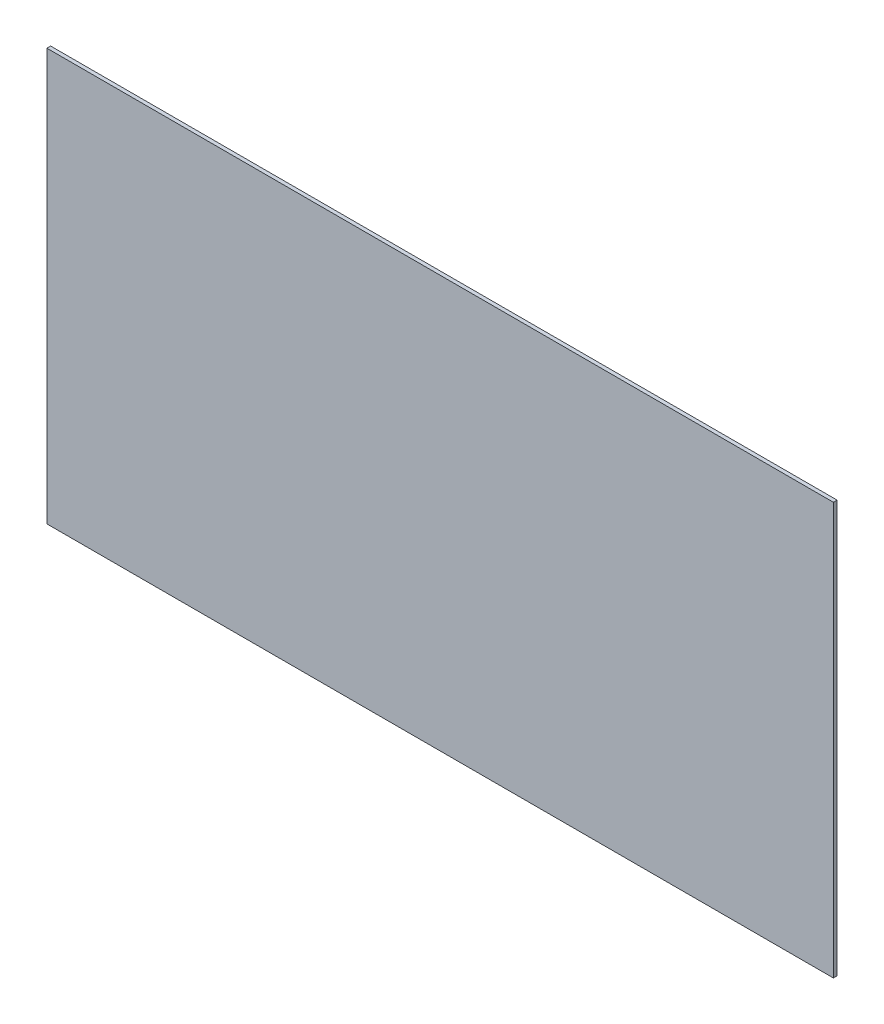
ISO-10303-21;
HEADER;
FILE_DESCRIPTION(('STEP AP214'),'2;1');
FILE_NAME('part.step','',(''),(''),'','','');
FILE_SCHEMA(('AUTOMOTIVE_DESIGN { 1 0 10303 214 1 1 1 1 }'));
ENDSEC;
DATA;
#1=APPLICATION_CONTEXT('core data for automotive mechanical design processes');
#2=APPLICATION_PROTOCOL_DEFINITION('international standard','automotive_design',2000,#1);
#3=PRODUCT_CONTEXT('',#1,'mechanical');
#4=PRODUCT('Part','Part','',(#3));
#5=PRODUCT_RELATED_PRODUCT_CATEGORY('part','',(#4));
#6=PRODUCT_DEFINITION_FORMATION('','',#4);
#7=PRODUCT_DEFINITION_CONTEXT('part definition',#1,'design');
#8=PRODUCT_DEFINITION('design','',#6,#7);
#9=PRODUCT_DEFINITION_SHAPE('','',#8);
#10=(LENGTH_UNIT() NAMED_UNIT(*) SI_UNIT(.MILLI.,.METRE.));
#11=(NAMED_UNIT(*) PLANE_ANGLE_UNIT() SI_UNIT($,.RADIAN.));
#12=(NAMED_UNIT(*) SI_UNIT($,.STERADIAN.) SOLID_ANGLE_UNIT());
#13=UNCERTAINTY_MEASURE_WITH_UNIT(LENGTH_MEASURE(1.E-05),#10,'distance_accuracy_value','');
#14=(GEOMETRIC_REPRESENTATION_CONTEXT(3) GLOBAL_UNCERTAINTY_ASSIGNED_CONTEXT((#13)) GLOBAL_UNIT_ASSIGNED_CONTEXT((#10,
#11,#12)) REPRESENTATION_CONTEXT('',''));
#15=CARTESIAN_POINT('',(0.,0.,0.));
#16=DIRECTION('',(0.,0.,1.));
#17=DIRECTION('',(1.,0.,0.));
#18=AXIS2_PLACEMENT_3D('',#15,#16,#17);
#19=CARTESIAN_POINT('',(0.,0.,3.));
#20=DIRECTION('',(1.,0.,0.));
#21=DIRECTION('',(0.,0.,-1.));
#22=AXIS2_PLACEMENT_3D('',#19,#20,#21);
#23=PLANE('',#22);
#24=DIRECTION('',(0.,-1.,0.));
#25=VECTOR('',#24,1.);
#26=CARTESIAN_POINT('',(0.,0.,0.));
#27=LINE('',#26,#25);
#28=CARTESIAN_POINT('',(0.,330.,0.));
#29=VERTEX_POINT('',#28);
#30=CARTESIAN_POINT('',(0.,0.,0.));
#31=VERTEX_POINT('',#30);
#32=EDGE_CURVE('E96',#29,#31,#27,.T.);
#33=ORIENTED_EDGE('',*,*,#32,.T.);
#34=DIRECTION('',(0.,0.,-1.));
#35=VECTOR('',#34,1.);
#36=CARTESIAN_POINT('',(0.,0.,3.));
#37=LINE('',#36,#35);
#38=CARTESIAN_POINT('',(0.,0.,3.));
#39=VERTEX_POINT('',#38);
#40=EDGE_CURVE('E11',#39,#31,#37,.T.);
#41=ORIENTED_EDGE('',*,*,#40,.F.);
#42=DIRECTION('',(0.,-1.,0.));
#43=VECTOR('',#42,1.);
#44=CARTESIAN_POINT('',(0.,0.,3.));
#45=LINE('',#44,#43);
#46=CARTESIAN_POINT('',(0.,330.,3.));
#47=VERTEX_POINT('',#46);
#48=EDGE_CURVE('E84',#47,#39,#45,.T.);
#49=ORIENTED_EDGE('',*,*,#48,.F.);
#50=DIRECTION('',(0.,0.,-1.));
#51=VECTOR('',#50,1.);
#52=CARTESIAN_POINT('',(0.,330.,3.));
#53=LINE('',#52,#51);
#54=EDGE_CURVE('E92',#47,#29,#53,.T.);
#55=ORIENTED_EDGE('',*,*,#54,.T.);
#56=EDGE_LOOP('',(#33,#41,#49,#55));
#57=FACE_BOUND('',#56,.T.);
#58=ADVANCED_FACE('F33',(#57),#23,.F.);
#59=CARTESIAN_POINT('',(0.,0.,3.));
#60=DIRECTION('',(0.,1.,0.));
#61=DIRECTION('',(0.,0.,1.));
#62=AXIS2_PLACEMENT_3D('',#59,#60,#61);
#63=PLANE('',#62);
#64=DIRECTION('',(1.,0.,0.));
#65=VECTOR('',#64,1.);
#66=CARTESIAN_POINT('',(0.,0.,0.));
#67=LINE('',#66,#65);
#68=CARTESIAN_POINT('',(630.,0.,0.));
#69=VERTEX_POINT('',#68);
#70=EDGE_CURVE('E88',#31,#69,#67,.T.);
#71=ORIENTED_EDGE('',*,*,#70,.T.);
#72=DIRECTION('',(0.,0.,-1.));
#73=VECTOR('',#72,1.);
#74=CARTESIAN_POINT('',(630.,0.,3.));
#75=LINE('',#74,#73);
#76=CARTESIAN_POINT('',(630.,0.,3.));
#77=VERTEX_POINT('',#76);
#78=EDGE_CURVE('E41',#77,#69,#75,.T.);
#79=ORIENTED_EDGE('',*,*,#78,.F.);
#80=DIRECTION('',(1.,0.,0.));
#81=VECTOR('',#80,1.);
#82=CARTESIAN_POINT('',(0.,0.,3.));
#83=LINE('',#82,#81);
#84=EDGE_CURVE('E79',#39,#77,#83,.T.);
#85=ORIENTED_EDGE('',*,*,#84,.F.);
#86=ORIENTED_EDGE('',*,*,#40,.T.);
#87=EDGE_LOOP('',(#71,#79,#85,#86));
#88=FACE_BOUND('',#87,.T.);
#89=ADVANCED_FACE('F87',(#88),#63,.F.);
#90=CARTESIAN_POINT('',(630.,0.,3.));
#91=DIRECTION('',(-1.,0.,0.));
#92=DIRECTION('',(0.,0.,1.));
#93=AXIS2_PLACEMENT_3D('',#90,#91,#92);
#94=PLANE('',#93);
#95=DIRECTION('',(0.,1.,0.));
#96=VECTOR('',#95,1.);
#97=CARTESIAN_POINT('',(630.,0.,0.));
#98=LINE('',#97,#96);
#99=CARTESIAN_POINT('',(630.,330.,0.));
#100=VERTEX_POINT('',#99);
#101=EDGE_CURVE('E66',#69,#100,#98,.T.);
#102=ORIENTED_EDGE('',*,*,#101,.T.);
#103=DIRECTION('',(0.,0.,-1.));
#104=VECTOR('',#103,1.);
#105=CARTESIAN_POINT('',(630.,330.,3.));
#106=LINE('',#105,#104);
#107=CARTESIAN_POINT('',(630.,330.,3.));
#108=VERTEX_POINT('',#107);
#109=EDGE_CURVE('E89',#108,#100,#106,.T.);
#110=ORIENTED_EDGE('',*,*,#109,.F.);
#111=DIRECTION('',(0.,1.,0.));
#112=VECTOR('',#111,1.);
#113=CARTESIAN_POINT('',(630.,0.,3.));
#114=LINE('',#113,#112);
#115=EDGE_CURVE('E82',#77,#108,#114,.T.);
#116=ORIENTED_EDGE('',*,*,#115,.F.);
#117=ORIENTED_EDGE('',*,*,#78,.T.);
#118=EDGE_LOOP('',(#102,#110,#116,#117));
#119=FACE_BOUND('',#118,.T.);
#120=ADVANCED_FACE('F90',(#119),#94,.F.);
#121=CARTESIAN_POINT('',(0.,330.,3.));
#122=DIRECTION('',(0.,-1.,0.));
#123=DIRECTION('',(0.,0.,-1.));
#124=AXIS2_PLACEMENT_3D('',#121,#122,#123);
#125=PLANE('',#124);
#126=DIRECTION('',(-1.,0.,0.));
#127=VECTOR('',#126,1.);
#128=CARTESIAN_POINT('',(0.,330.,0.));
#129=LINE('',#128,#127);
#130=EDGE_CURVE('E72',#100,#29,#129,.T.);
#131=ORIENTED_EDGE('',*,*,#130,.T.);
#132=ORIENTED_EDGE('',*,*,#54,.F.);
#133=DIRECTION('',(-1.,0.,0.));
#134=VECTOR('',#133,1.);
#135=CARTESIAN_POINT('',(0.,330.,3.));
#136=LINE('',#135,#134);
#137=EDGE_CURVE('E49',#108,#47,#136,.T.);
#138=ORIENTED_EDGE('',*,*,#137,.F.);
#139=ORIENTED_EDGE('',*,*,#109,.T.);
#140=EDGE_LOOP('',(#131,#132,#138,#139));
#141=FACE_BOUND('',#140,.T.);
#142=ADVANCED_FACE('F103',(#141),#125,.F.);
#143=CARTESIAN_POINT('',(0.,0.,3.));
#144=DIRECTION('',(0.,0.,-1.));
#145=DIRECTION('',(-1.,0.,0.));
#146=AXIS2_PLACEMENT_3D('',#143,#144,#145);
#147=PLANE('',#146);
#148=ORIENTED_EDGE('',*,*,#48,.T.);
#149=ORIENTED_EDGE('',*,*,#84,.T.);
#150=ORIENTED_EDGE('',*,*,#115,.T.);
#151=ORIENTED_EDGE('',*,*,#137,.T.);
#152=EDGE_LOOP('',(#148,#149,#150,#151));
#153=FACE_BOUND('',#152,.T.);
#154=ADVANCED_FACE('F80',(#153),#147,.F.);
#155=CARTESIAN_POINT('',(0.,0.,0.));
#156=DIRECTION('',(0.,0.,-1.));
#157=DIRECTION('',(-1.,0.,0.));
#158=AXIS2_PLACEMENT_3D('',#155,#156,#157);
#159=PLANE('',#158);
#160=ORIENTED_EDGE('',*,*,#32,.F.);
#161=ORIENTED_EDGE('',*,*,#130,.F.);
#162=ORIENTED_EDGE('',*,*,#101,.F.);
#163=ORIENTED_EDGE('',*,*,#70,.F.);
#164=EDGE_LOOP('',(#160,#161,#162,#163));
#165=FACE_BOUND('',#164,.T.);
#166=ADVANCED_FACE('F106',(#165),#159,.T.);
#167=CLOSED_SHELL('',(#58,#89,#120,#142,#154,#166));
#168=MANIFOLD_SOLID_BREP('B2',#167);
#169=ADVANCED_BREP_SHAPE_REPRESENTATION('',(#18,#168),#14);
#170=SHAPE_DEFINITION_REPRESENTATION(#9,#169);
ENDSEC;
END-ISO-10303-21;
